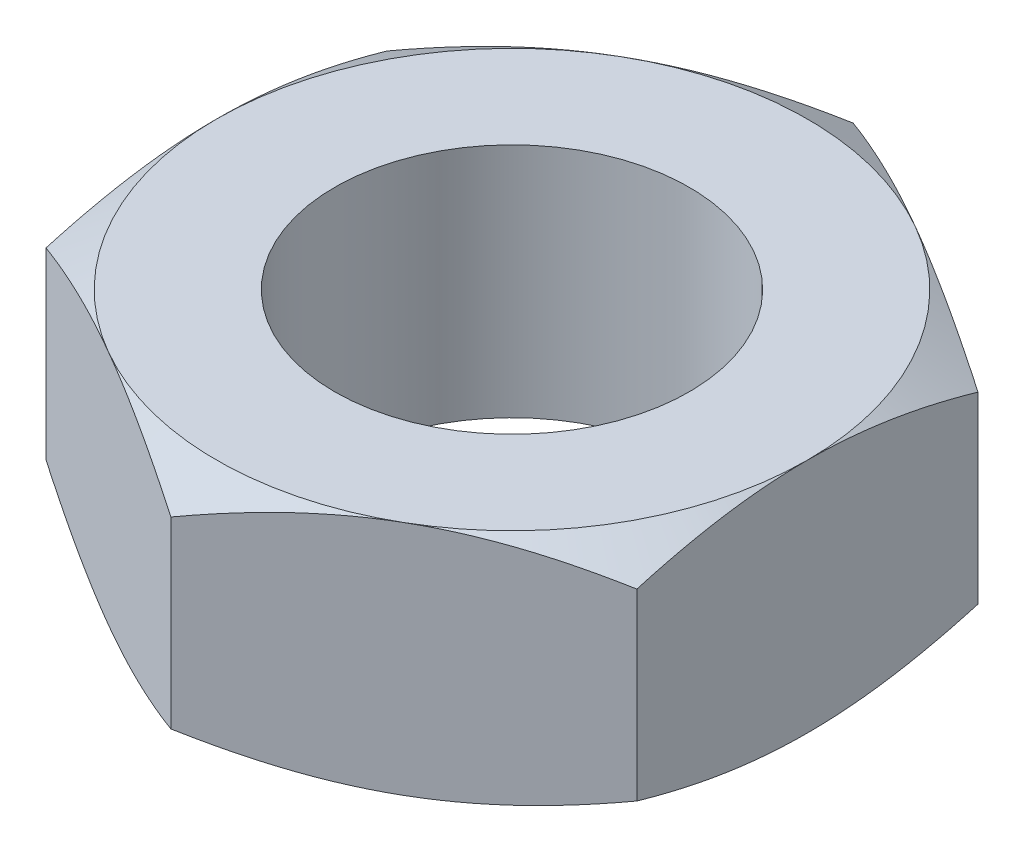
ISO-10303-21;
HEADER;
FILE_DESCRIPTION(('STEP AP214'),'2;1');
FILE_NAME('part.step','',(''),(''),'','','');
FILE_SCHEMA(('AUTOMOTIVE_DESIGN { 1 0 10303 214 1 1 1 1 }'));
ENDSEC;
DATA;
#1=APPLICATION_CONTEXT('core data for automotive mechanical design processes');
#2=APPLICATION_PROTOCOL_DEFINITION('international standard','automotive_design',2000,#1);
#3=PRODUCT_CONTEXT('',#1,'mechanical');
#4=PRODUCT('Part','Part','',(#3));
#5=PRODUCT_RELATED_PRODUCT_CATEGORY('part','',(#4));
#6=PRODUCT_DEFINITION_FORMATION('','',#4);
#7=PRODUCT_DEFINITION_CONTEXT('part definition',#1,'design');
#8=PRODUCT_DEFINITION('design','',#6,#7);
#9=PRODUCT_DEFINITION_SHAPE('','',#8);
#10=(LENGTH_UNIT() NAMED_UNIT(*) SI_UNIT(.MILLI.,.METRE.));
#11=(NAMED_UNIT(*) PLANE_ANGLE_UNIT() SI_UNIT($,.RADIAN.));
#12=(NAMED_UNIT(*) SI_UNIT($,.STERADIAN.) SOLID_ANGLE_UNIT());
#13=UNCERTAINTY_MEASURE_WITH_UNIT(LENGTH_MEASURE(1.E-05),#10,'distance_accuracy_value','');
#14=(GEOMETRIC_REPRESENTATION_CONTEXT(3) GLOBAL_UNCERTAINTY_ASSIGNED_CONTEXT((#13)) GLOBAL_UNIT_ASSIGNED_CONTEXT((#10,
#11,#12)) REPRESENTATION_CONTEXT('',''));
#15=CARTESIAN_POINT('',(0.,0.,0.));
#16=DIRECTION('',(0.,0.,1.));
#17=DIRECTION('',(1.,0.,0.));
#18=AXIS2_PLACEMENT_3D('',#15,#16,#17);
#19=CARTESIAN_POINT('',(0.,0.,0.));
#20=DIRECTION('',(0.,1.,0.));
#21=DIRECTION('',(0.,0.,1.));
#22=AXIS2_PLACEMENT_3D('',#19,#20,#21);
#23=PLANE('',#22);
#24=CARTESIAN_POINT('',(0.,0.,0.));
#25=DIRECTION('',(0.,1.,0.));
#26=DIRECTION('',(0.,0.,1.));
#27=AXIS2_PLACEMENT_3D('',#24,#25,#26);
#28=CIRCLE('',#27,1.5);
#29=CARTESIAN_POINT('',(0.,0.,1.5));
#30=VERTEX_POINT('',#29);
#31=EDGE_CURVE('E277',#30,#30,#28,.T.);
#32=ORIENTED_EDGE('',*,*,#31,.T.);
#33=EDGE_LOOP('',(#32));
#34=FACE_BOUND('',#33,.T.);
#35=CARTESIAN_POINT('',(0.,0.,0.));
#36=DIRECTION('',(0.,1.,0.));
#37=DIRECTION('',(0.,0.,1.));
#38=AXIS2_PLACEMENT_3D('',#35,#36,#37);
#39=CIRCLE('',#38,2.5);
#40=CARTESIAN_POINT('',(1.25,0.,2.1650635094611));
#41=VERTEX_POINT('',#40);
#42=CARTESIAN_POINT('',(-1.25,0.,2.1650635094611));
#43=VERTEX_POINT('',#42);
#44=EDGE_CURVE('E52',#41,#43,#39,.F.);
#45=ORIENTED_EDGE('',*,*,#44,.T.);
#46=CARTESIAN_POINT('',(-2.5,0.,0.));
#47=VERTEX_POINT('',#46);
#48=EDGE_CURVE('E12',#43,#47,#39,.F.);
#49=ORIENTED_EDGE('',*,*,#48,.T.);
#50=CARTESIAN_POINT('',(-1.25,0.,-2.1650635094611));
#51=VERTEX_POINT('',#50);
#52=EDGE_CURVE('E58',#47,#51,#39,.F.);
#53=ORIENTED_EDGE('',*,*,#52,.T.);
#54=CARTESIAN_POINT('',(1.25,0.,-2.1650635094611));
#55=VERTEX_POINT('',#54);
#56=EDGE_CURVE('E398',#51,#55,#39,.F.);
#57=ORIENTED_EDGE('',*,*,#56,.T.);
#58=CARTESIAN_POINT('',(2.5,0.,0.));
#59=VERTEX_POINT('',#58);
#60=EDGE_CURVE('E161',#55,#59,#39,.F.);
#61=ORIENTED_EDGE('',*,*,#60,.T.);
#62=CARTESIAN_POINT('',(0.,0.,0.));
#63=DIRECTION('',(0.,1.,0.));
#64=DIRECTION('',(0.,0.,1.));
#65=AXIS2_PLACEMENT_3D('',#62,#63,#64);
#66=CIRCLE('',#65,2.5);
#67=EDGE_CURVE('E142',#41,#59,#66,.T.);
#68=ORIENTED_EDGE('',*,*,#67,.F.);
#69=EDGE_LOOP('',(#45,#49,#53,#57,#61,#68));
#70=FACE_BOUND('',#69,.T.);
#71=ADVANCED_FACE('F47',(#34,#70),#23,.F.);
#72=CARTESIAN_POINT('',(0.,2.,0.));
#73=DIRECTION('',(0.,1.,0.));
#74=DIRECTION('',(0.,0.,1.));
#75=AXIS2_PLACEMENT_3D('',#72,#73,#74);
#76=PLANE('',#75);
#77=CARTESIAN_POINT('',(0.,2.,0.));
#78=DIRECTION('',(0.,1.,0.));
#79=DIRECTION('',(0.,0.,1.));
#80=AXIS2_PLACEMENT_3D('',#77,#78,#79);
#81=CIRCLE('',#80,1.5);
#82=CARTESIAN_POINT('',(0.,2.,1.5));
#83=VERTEX_POINT('',#82);
#84=EDGE_CURVE('E272',#83,#83,#81,.T.);
#85=ORIENTED_EDGE('',*,*,#84,.F.);
#86=EDGE_LOOP('',(#85));
#87=FACE_BOUND('',#86,.T.);
#88=CARTESIAN_POINT('',(0.,2.,0.));
#89=DIRECTION('',(0.,1.,0.));
#90=DIRECTION('',(0.,0.,1.));
#91=AXIS2_PLACEMENT_3D('',#88,#89,#90);
#92=CIRCLE('',#91,2.5);
#93=CARTESIAN_POINT('',(-1.25,2.,2.1650635094611));
#94=VERTEX_POINT('',#93);
#95=CARTESIAN_POINT('',(1.25,2.,2.1650635094611));
#96=VERTEX_POINT('',#95);
#97=EDGE_CURVE('E334',#94,#96,#92,.T.);
#98=ORIENTED_EDGE('',*,*,#97,.T.);
#99=CARTESIAN_POINT('',(2.5,2.,0.));
#100=VERTEX_POINT('',#99);
#101=EDGE_CURVE('E337',#96,#100,#92,.T.);
#102=ORIENTED_EDGE('',*,*,#101,.T.);
#103=CARTESIAN_POINT('',(1.25,2.,-2.1650635094611));
#104=VERTEX_POINT('',#103);
#105=EDGE_CURVE('E349',#100,#104,#92,.T.);
#106=ORIENTED_EDGE('',*,*,#105,.T.);
#107=CARTESIAN_POINT('',(-1.25,2.,-2.1650635094611));
#108=VERTEX_POINT('',#107);
#109=EDGE_CURVE('E353',#104,#108,#92,.T.);
#110=ORIENTED_EDGE('',*,*,#109,.T.);
#111=CARTESIAN_POINT('',(-2.5,2.,0.));
#112=VERTEX_POINT('',#111);
#113=EDGE_CURVE('E346',#108,#112,#92,.T.);
#114=ORIENTED_EDGE('',*,*,#113,.T.);
#115=EDGE_CURVE('E339',#112,#94,#92,.T.);
#116=ORIENTED_EDGE('',*,*,#115,.T.);
#117=EDGE_LOOP('',(#98,#102,#106,#110,#114,#116));
#118=FACE_BOUND('',#117,.T.);
#119=ADVANCED_FACE('F315',(#87,#118),#76,.T.);
#120=CARTESIAN_POINT('',(2.5,2.,-1.44337567297407));
#121=DIRECTION('',(-0.5,0.,0.866025403784439));
#122=DIRECTION('',(0.866025403784439,0.,0.5));
#123=AXIS2_PLACEMENT_3D('',#120,#121,#122);
#124=PLANE('',#123);
#125=DIRECTION('',(0.,-1.,0.));
#126=VECTOR('',#125,1.);
#127=CARTESIAN_POINT('',(2.5,2.,-1.44337567297407));
#128=LINE('',#127,#126);
#129=CARTESIAN_POINT('',(2.5,1.77670900630741,-1.44337567297408));
#130=VERTEX_POINT('',#129);
#131=CARTESIAN_POINT('',(2.5,0.2232909936926,-1.44337567297407));
#132=VERTEX_POINT('',#131);
#133=EDGE_CURVE('E276',#130,#132,#128,.T.);
#134=ORIENTED_EDGE('',*,*,#133,.T.);
#135=CARTESIAN_POINT('',(2.5002,0.223357664359107,-1.44326020292023));
#136=CARTESIAN_POINT('',(2.39033676526513,0.186721620107625,-1.50668977106845));
#137=CARTESIAN_POINT('',(2.27952520010347,0.153402218965055,-1.57066685804385));
#138=CARTESIAN_POINT('',(2.05598316653395,0.0952422855578571,-1.69972891130041));
#139=CARTESIAN_POINT('',(1.94324872547161,0.0704223291477376,-1.7648161711947));
#140=CARTESIAN_POINT('',(1.71917700612473,0.0317856514410516,-1.8941840386774));
#141=CARTESIAN_POINT('',(1.60787420823262,0.0177117961856387,-1.95844473900197));
#142=CARTESIAN_POINT('',(1.38474477253166,0.000909152352750007,-2.08726857876804));
#143=CARTESIAN_POINT('',(1.27291894598577,-0.00183354879637381,-2.15183124982667));
#144=CARTESIAN_POINT('',(1.06395802444848,0.00386576000805309,-2.27247489412634));
#145=CARTESIAN_POINT('',(0.966791682442267,0.0109083943818614,-2.32857390783979));
#146=CARTESIAN_POINT('',(0.773092050288996,0.0332314191249422,-2.44040644260542));
#147=CARTESIAN_POINT('',(0.676559430340267,0.0485194384402666,-2.4961395767184));
#148=CARTESIAN_POINT('',(0.482460278259523,0.0867390938444197,-2.60820277442169));
#149=CARTESIAN_POINT('',(0.384918318217859,0.109832776125517,-2.66451865130903));
#150=CARTESIAN_POINT('',(0.191289391923915,0.162246656577913,-2.77631036402774));
#151=CARTESIAN_POINT('',(0.0951999441138237,0.191554535624548,-2.83178763258717));
#152=CARTESIAN_POINT('',(-0.000200000000000355,0.223357664359107,-2.88686681600197));
#153=B_SPLINE_CURVE_WITH_KNOTS('',3,(#135,#136,#137,#138,#139,#140,#141,#142,#143,#144,#145,
#146,#147,#148,#149,#150,#151,#152),.UNSPECIFIED.,.F.,.F.,(4,2,2,2,2,2,2,2,4),(0.,
0.396285827362226,0.79352433015205,1.18093086852114,1.56786160134475,1.90479741793733,
2.24204551660463,2.58677531536756,2.93082800105256),.UNSPECIFIED.);
#154=EDGE_CURVE('E71',#132,#55,#153,.T.);
#155=ORIENTED_EDGE('',*,*,#154,.T.);
#156=CARTESIAN_POINT('',(0.,0.223290993692601,-2.88675134594813));
#157=VERTEX_POINT('',#156);
#158=EDGE_CURVE('E206',#55,#157,#153,.T.);
#159=ORIENTED_EDGE('',*,*,#158,.T.);
#160=DIRECTION('',(0.,-1.,0.));
#161=VECTOR('',#160,1.);
#162=CARTESIAN_POINT('',(0.,2.,-2.88675134594813));
#163=LINE('',#162,#161);
#164=CARTESIAN_POINT('',(0.,1.7767090063074,-2.88675134594813));
#165=VERTEX_POINT('',#164);
#166=EDGE_CURVE('E297',#165,#157,#163,.T.);
#167=ORIENTED_EDGE('',*,*,#166,.F.);
#168=CARTESIAN_POINT('',(2.5002,1.77664233564089,-1.44326020292023));
#169=CARTESIAN_POINT('',(2.39033676526513,1.81327837989238,-1.50668977106845));
#170=CARTESIAN_POINT('',(2.27952520010347,1.84659778103494,-1.57066685804385));
#171=CARTESIAN_POINT('',(2.05598316653395,1.90475771444214,-1.69972891130041));
#172=CARTESIAN_POINT('',(1.94324872547161,1.92957767085226,-1.7648161711947));
#173=CARTESIAN_POINT('',(1.71917700612473,1.96821434855895,-1.8941840386774));
#174=CARTESIAN_POINT('',(1.60787420823262,1.98228820381436,-1.95844473900197));
#175=CARTESIAN_POINT('',(1.38474477253166,1.99909084764725,-2.08726857876804));
#176=CARTESIAN_POINT('',(1.27291894598577,2.00183354879637,-2.15183124982667));
#177=CARTESIAN_POINT('',(1.06395802444848,1.99613423999195,-2.27247489412634));
#178=CARTESIAN_POINT('',(0.966791682442267,1.98909160561814,-2.32857390783979));
#179=CARTESIAN_POINT('',(0.773092050288996,1.96676858087506,-2.44040644260542));
#180=CARTESIAN_POINT('',(0.676559430340267,1.95148056155973,-2.4961395767184));
#181=CARTESIAN_POINT('',(0.482460278259523,1.91326090615558,-2.60820277442169));
#182=CARTESIAN_POINT('',(0.384918318217859,1.89016722387448,-2.66451865130903));
#183=CARTESIAN_POINT('',(0.191289391923915,1.83775334342209,-2.77631036402774));
#184=CARTESIAN_POINT('',(0.0951999441138237,1.80844546437545,-2.83178763258717));
#185=CARTESIAN_POINT('',(-0.000200000000000355,1.77664233564089,-2.88686681600197));
#186=B_SPLINE_CURVE_WITH_KNOTS('',3,(#168,#169,#170,#171,#172,#173,#174,#175,#176,#177,#178,
#179,#180,#181,#182,#183,#184,#185),.UNSPECIFIED.,.F.,.F.,(4,2,2,2,2,2,2,2,4),(0.,
0.396285827362227,0.793524330152051,1.18093086852114,1.56786160134475,1.90479741793733,
2.24204551660463,2.58677531536756,2.93082800105256),.UNSPECIFIED.);
#187=EDGE_CURVE('E264',#104,#165,#186,.T.);
#188=ORIENTED_EDGE('',*,*,#187,.F.);
#189=EDGE_CURVE('E271',#130,#104,#186,.T.);
#190=ORIENTED_EDGE('',*,*,#189,.F.);
#191=EDGE_LOOP('',(#134,#155,#159,#167,#188,#190));
#192=FACE_BOUND('',#191,.T.);
#193=ADVANCED_FACE('F49',(#192),#124,.F.);
#194=CARTESIAN_POINT('',(0.,2.,-2.88675134594813));
#195=DIRECTION('',(0.5,0.,0.866025403784439));
#196=DIRECTION('',(0.866025403784439,0.,-0.5));
#197=AXIS2_PLACEMENT_3D('',#194,#195,#196);
#198=PLANE('',#197);
#199=ORIENTED_EDGE('',*,*,#166,.T.);
#200=CARTESIAN_POINT('',(0.000199999999999646,0.223357664359108,-2.88686681600197));
#201=CARTESIAN_POINT('',(-0.109663234734871,0.186721620107625,-2.82343724785375));
#202=CARTESIAN_POINT('',(-0.220474799896526,0.153402218965056,-2.75946016087834));
#203=CARTESIAN_POINT('',(-0.44401683346605,0.0952422855578572,-2.63039810762178));
#204=CARTESIAN_POINT('',(-0.556751274528388,0.0704223291477378,-2.5653108477275));
#205=CARTESIAN_POINT('',(-0.780822993875269,0.0317856514410515,-2.43594298024479));
#206=CARTESIAN_POINT('',(-0.892125791767377,0.0177117961856385,-2.37168227992023));
#207=CARTESIAN_POINT('',(-1.11525522746833,0.000909152352749769,-2.24285844015415));
#208=CARTESIAN_POINT('',(-1.22708105401423,-0.0018335487963739,-2.17829576909552));
#209=CARTESIAN_POINT('',(-1.43604197555152,0.00386576000805306,-2.05765212479586));
#210=CARTESIAN_POINT('',(-1.53320831755773,0.0109083943818613,-2.0015531110824));
#211=CARTESIAN_POINT('',(-1.726907949711,0.033231419124942,-1.88972057631678));
#212=CARTESIAN_POINT('',(-1.82344056965973,0.0485194384402664,-1.8339874422038));
#213=CARTESIAN_POINT('',(-2.01753972174048,0.0867390938444195,-1.7219242445005));
#214=CARTESIAN_POINT('',(-2.11508168178214,0.109832776125516,-1.66560836761316));
#215=CARTESIAN_POINT('',(-2.30871060807608,0.162246656577912,-1.55381665489446));
#216=CARTESIAN_POINT('',(-2.40480005588618,0.191554535624547,-1.49833938633502));
#217=CARTESIAN_POINT('',(-2.5002,0.223357664359107,-1.44326020292023));
#218=B_SPLINE_CURVE_WITH_KNOTS('',3,(#200,#201,#202,#203,#204,#205,#206,#207,#208,#209,#210,
#211,#212,#213,#214,#215,#216,#217),.UNSPECIFIED.,.F.,.F.,(4,2,2,2,2,2,2,2,4),(0.,
0.396285827362227,0.793524330152051,1.18093086852114,1.56786160134475,1.90479741793733,
2.24204551660463,2.58677531536756,2.93082800105256),.UNSPECIFIED.);
#219=EDGE_CURVE('E404',#157,#51,#218,.T.);
#220=ORIENTED_EDGE('',*,*,#219,.T.);
#221=CARTESIAN_POINT('',(-2.5,0.223290993692601,-1.44337567297406));
#222=VERTEX_POINT('',#221);
#223=EDGE_CURVE('E225',#51,#222,#218,.T.);
#224=ORIENTED_EDGE('',*,*,#223,.T.);
#225=DIRECTION('',(0.,-1.,0.));
#226=VECTOR('',#225,1.);
#227=CARTESIAN_POINT('',(-2.5,2.,-1.44337567297406));
#228=LINE('',#227,#226);
#229=CARTESIAN_POINT('',(-2.5,1.7767090063074,-1.44337567297406));
#230=VERTEX_POINT('',#229);
#231=EDGE_CURVE('E293',#230,#222,#228,.T.);
#232=ORIENTED_EDGE('',*,*,#231,.F.);
#233=CARTESIAN_POINT('',(0.000199999999999668,1.77664233564089,-2.88686681600197));
#234=CARTESIAN_POINT('',(-0.109663234734871,1.81327837989237,-2.82343724785375));
#235=CARTESIAN_POINT('',(-0.220474799896526,1.84659778103494,-2.75946016087834));
#236=CARTESIAN_POINT('',(-0.44401683346605,1.90475771444214,-2.63039810762178));
#237=CARTESIAN_POINT('',(-0.556751274528388,1.92957767085226,-2.5653108477275));
#238=CARTESIAN_POINT('',(-0.780822993875269,1.96821434855895,-2.43594298024479));
#239=CARTESIAN_POINT('',(-0.892125791767377,1.98228820381436,-2.37168227992023));
#240=CARTESIAN_POINT('',(-1.11525522746833,1.99909084764725,-2.24285844015415));
#241=CARTESIAN_POINT('',(-1.22708105401423,2.00183354879637,-2.17829576909552));
#242=CARTESIAN_POINT('',(-1.43604197555152,1.99613423999195,-2.05765212479586));
#243=CARTESIAN_POINT('',(-1.53320831755773,1.98909160561814,-2.0015531110824));
#244=CARTESIAN_POINT('',(-1.726907949711,1.96676858087506,-1.88972057631678));
#245=CARTESIAN_POINT('',(-1.82344056965973,1.95148056155973,-1.8339874422038));
#246=CARTESIAN_POINT('',(-2.01753972174048,1.91326090615558,-1.7219242445005));
#247=CARTESIAN_POINT('',(-2.11508168178214,1.89016722387448,-1.66560836761316));
#248=CARTESIAN_POINT('',(-2.30871060807608,1.83775334342209,-1.55381665489446));
#249=CARTESIAN_POINT('',(-2.40480005588618,1.80844546437545,-1.49833938633502));
#250=CARTESIAN_POINT('',(-2.5002,1.77664233564089,-1.44326020292023));
#251=B_SPLINE_CURVE_WITH_KNOTS('',3,(#233,#234,#235,#236,#237,#238,#239,#240,#241,#242,#243,
#244,#245,#246,#247,#248,#249,#250),.UNSPECIFIED.,.F.,.F.,(4,2,2,2,2,2,2,2,4),(0.,
0.396285827362227,0.793524330152051,1.18093086852114,1.56786160134475,1.90479741793733,
2.24204551660463,2.58677531536756,2.93082800105256),.UNSPECIFIED.);
#252=EDGE_CURVE('E256',#108,#230,#251,.T.);
#253=ORIENTED_EDGE('',*,*,#252,.F.);
#254=EDGE_CURVE('E263',#165,#108,#251,.T.);
#255=ORIENTED_EDGE('',*,*,#254,.F.);
#256=EDGE_LOOP('',(#199,#220,#224,#232,#253,#255));
#257=FACE_BOUND('',#256,.T.);
#258=ADVANCED_FACE('F234',(#257),#198,.F.);
#259=CARTESIAN_POINT('',(-2.5,2.,-1.44337567297406));
#260=DIRECTION('',(1.,0.,0.));
#261=DIRECTION('',(0.,0.,-1.));
#262=AXIS2_PLACEMENT_3D('',#259,#260,#261);
#263=PLANE('',#262);
#264=ORIENTED_EDGE('',*,*,#231,.T.);
#265=CARTESIAN_POINT('',(-2.5,1.75051746805577,-4.93486171933444));
#266=CARTESIAN_POINT('',(-2.5,1.69133726261722,-4.8199403481942));
#267=CARTESIAN_POINT('',(-2.5,1.63247825676005,-4.70485212642124));
#268=CARTESIAN_POINT('',(-2.5,1.51556406119456,-4.47426567976795));
#269=CARTESIAN_POINT('',(-2.5,1.45750888635443,-4.35876744735329));
#270=CARTESIAN_POINT('',(-2.5,1.34227244134488,-4.12710089531367));
#271=CARTESIAN_POINT('',(-2.5,1.28509274407798,-4.01093179192169));
#272=CARTESIAN_POINT('',(-2.5,1.17192590701674,-3.77801122649482));
#273=CARTESIAN_POINT('',(-2.5,1.11593878415348,-3.66125975622101));
#274=CARTESIAN_POINT('',(-2.5,1.00253157682963,-3.42088300849687));
#275=CARTESIAN_POINT('',(-2.5,0.945191561608959,-3.2972198482005));
#276=CARTESIAN_POINT('',(-2.5,0.832598686179215,-3.04894788037271));
#277=CARTESIAN_POINT('',(-2.5,0.777345769924555,-2.92433909834246));
#278=CARTESIAN_POINT('',(-2.5,0.669564709168183,-2.67404231382757));
#279=CARTESIAN_POINT('',(-2.5,0.61703474416575,-2.54835509963059));
#280=CARTESIAN_POINT('',(-2.5,0.515470603951828,-2.29553518807957));
#281=CARTESIAN_POINT('',(-2.5,0.466437240853757,-2.16840216282303));
#282=CARTESIAN_POINT('',(-2.5,0.365519045589159,-1.89196933857388));
#283=CARTESIAN_POINT('',(-2.5,0.314430928565564,-1.74237414052597));
#284=CARTESIAN_POINT('',(-2.5,0.220856049236354,-1.4405551511059));
#285=CARTESIAN_POINT('',(-2.5,0.178364945289852,-1.28833272889575));
#286=CARTESIAN_POINT('',(-2.5,0.105752289587978,-0.983942199808394));
#287=CARTESIAN_POINT('',(-2.5,0.0754089672818105,-0.831829132495781));
#288=CARTESIAN_POINT('',(-2.5,0.0406516796303211,-0.602071425625841));
#289=CARTESIAN_POINT('',(-2.5,0.0308592992319906,-0.525228449493815));
#290=CARTESIAN_POINT('',(-2.5,0.0151636656794679,-0.371150643177171));
#291=CARTESIAN_POINT('',(-2.5,0.00925981943211461,-0.293915874561847));
#292=CARTESIAN_POINT('',(-2.5,0.00149945618362636,-0.138177308015548));
#293=CARTESIAN_POINT('',(-2.5,-0.000300329680073107,-0.0596706558577311));
#294=CARTESIAN_POINT('',(-2.5,0.000382182470508331,0.097323703774758));
#295=CARTESIAN_POINT('',(-2.5,0.00286448024898935,0.175811411250473));
#296=CARTESIAN_POINT('',(-2.5,0.012018075101874,0.332556462396662));
#297=CARTESIAN_POINT('',(-2.5,0.0186902391546215,0.410813755021102));
#298=CARTESIAN_POINT('',(-2.5,0.0359818737124378,0.566895759516458));
#299=CARTESIAN_POINT('',(-2.5,0.046601987886553,0.644720398746938));
#300=CARTESIAN_POINT('',(-2.5,0.0843776540425915,0.880425277323259));
#301=CARTESIAN_POINT('',(-2.5,0.117244290445988,1.0374021276822));
#302=CARTESIAN_POINT('',(-2.5,0.194551132550416,1.34841101742391));
#303=CARTESIAN_POINT('',(-2.5,0.238994974726618,1.50244211517955));
#304=CARTESIAN_POINT('',(-2.5,0.334467726657706,1.80198948227857));
#305=CARTESIAN_POINT('',(-2.5,0.385183371784436,1.94760725909515));
#306=CARTESIAN_POINT('',(-2.5,0.492317846941425,2.23674360042291));
#307=CARTESIAN_POINT('',(-2.5,0.54873807533058,2.38026164031034));
#308=CARTESIAN_POINT('',(-2.5,0.66580910898489,2.66572180096044));
#309=CARTESIAN_POINT('',(-2.5,0.726464237701914,2.80766213451906));
#310=CARTESIAN_POINT('',(-2.5,0.850881769521231,3.0901760741915));
#311=CARTESIAN_POINT('',(-2.5,0.914644342755142,3.23074960496675));
#312=CARTESIAN_POINT('',(-2.5,1.04081855009125,3.50283338488746));
#313=CARTESIAN_POINT('',(-2.5,1.10310046173394,3.63440403331771));
#314=CARTESIAN_POINT('',(-2.5,1.22929552548759,3.89676431270017));
#315=CARTESIAN_POINT('',(-2.5,1.29320873128699,4.02755391777178));
#316=CARTESIAN_POINT('',(-2.5,1.42210820195559,4.28806433847912));
#317=CARTESIAN_POINT('',(-2.5,1.48709022600769,4.41778725733017));
#318=CARTESIAN_POINT('',(-2.5,1.61808743263322,4.67669676330922));
#319=CARTESIAN_POINT('',(-2.5,1.68410252583257,4.8058833956229));
#320=CARTESIAN_POINT('',(-2.5,1.75051746805577,4.93486171933444));
#321=B_SPLINE_CURVE_WITH_KNOTS('',3,(#265,#266,#267,#268,#269,#270,#271,#272,#273,#274,#275,
#276,#277,#278,#279,#280,#281,#282,#283,#284,#285,#286,#287,#288,#289,#290,#291,#292,#293,#294,
#295,#296,#297,#298,#299,#300,#301,#302,#303,#304,#305,#306,#307,#308,#309,#310,#311,#312,#313,
#314,#315,#316,#317,#318,#319,#320),.UNSPECIFIED.,.F.,.F.,(4,2,2,2,2,2,2,2,2,2,2,2,2,2,2,2,2,2,
2,2,2,2,2,2,2,2,2,4),(0.,0.387793831894925,0.775594827128253,1.16402581850153,1.5524623207934,
1.96137758264064,2.37028185592793,2.77890912291195,3.1876309897647,3.66167496284643,
4.13547893462243,4.60018855861607,4.83249783003166,5.06477166059454,5.30023727903514,
5.53570288450944,5.77121722921933,6.00676998875774,6.48725754661896,6.96789621109927,
7.43032586595213,7.89286915182352,8.35589175957823,8.81893974621792,9.25562834373433,
9.69233133192936,10.1275921173417,10.5628154528867),.UNSPECIFIED.);
#322=EDGE_CURVE('E224',#222,#47,#321,.T.);
#323=ORIENTED_EDGE('',*,*,#322,.T.);
#324=CARTESIAN_POINT('',(-2.5,0.223290993692601,1.44337567297407));
#325=VERTEX_POINT('',#324);
#326=EDGE_CURVE('E216',#47,#325,#321,.T.);
#327=ORIENTED_EDGE('',*,*,#326,.T.);
#328=DIRECTION('',(0.,-1.,0.));
#329=VECTOR('',#328,1.);
#330=CARTESIAN_POINT('',(-2.5,2.,1.44337567297407));
#331=LINE('',#330,#329);
#332=CARTESIAN_POINT('',(-2.5,1.7767090063074,1.44337567297407));
#333=VERTEX_POINT('',#332);
#334=EDGE_CURVE('E289',#333,#325,#331,.T.);
#335=ORIENTED_EDGE('',*,*,#334,.F.);
#336=CARTESIAN_POINT('',(-2.5,0.249482531944229,-4.93486171933444));
#337=CARTESIAN_POINT('',(-2.5,0.308662737382782,-4.8199403481942));
#338=CARTESIAN_POINT('',(-2.5,0.367521743239951,-4.70485212642124));
#339=CARTESIAN_POINT('',(-2.5,0.484435938805441,-4.47426567976795));
#340=CARTESIAN_POINT('',(-2.5,0.542491113645564,-4.3587674473533));
#341=CARTESIAN_POINT('',(-2.5,0.657727558655124,-4.12710089531367));
#342=CARTESIAN_POINT('',(-2.5,0.714907255922024,-4.01093179192169));
#343=CARTESIAN_POINT('',(-2.5,0.828074092983265,-3.77801122649482));
#344=CARTESIAN_POINT('',(-2.5,0.884061215846522,-3.66125975622101));
#345=CARTESIAN_POINT('',(-2.5,0.997468423170369,-3.42088300849687));
#346=CARTESIAN_POINT('',(-2.5,1.05480843839104,-3.2972198482005));
#347=CARTESIAN_POINT('',(-2.5,1.16740131382078,-3.04894788037271));
#348=CARTESIAN_POINT('',(-2.5,1.22265423007544,-2.92433909834247));
#349=CARTESIAN_POINT('',(-2.5,1.33043529083182,-2.67404231382757));
#350=CARTESIAN_POINT('',(-2.5,1.38296525583425,-2.54835509963059));
#351=CARTESIAN_POINT('',(-2.5,1.48452939604817,-2.29553518807957));
#352=CARTESIAN_POINT('',(-2.5,1.53356275914624,-2.16840216282304));
#353=CARTESIAN_POINT('',(-2.5,1.63448095441084,-1.89196933857388));
#354=CARTESIAN_POINT('',(-2.5,1.68556907143444,-1.74237414052597));
#355=CARTESIAN_POINT('',(-2.5,1.77914395076365,-1.4405551511059));
#356=CARTESIAN_POINT('',(-2.5,1.82163505471015,-1.28833272889575));
#357=CARTESIAN_POINT('',(-2.5,1.89424771041202,-0.983942199808396));
#358=CARTESIAN_POINT('',(-2.5,1.92459103271819,-0.831829132495783));
#359=CARTESIAN_POINT('',(-2.5,1.95934832036968,-0.602071425625843));
#360=CARTESIAN_POINT('',(-2.5,1.96914070076801,-0.525228449493817));
#361=CARTESIAN_POINT('',(-2.5,1.98483633432053,-0.371150643177173));
#362=CARTESIAN_POINT('',(-2.5,1.99074018056789,-0.293915874561848));
#363=CARTESIAN_POINT('',(-2.5,1.99850054381637,-0.138177308015549));
#364=CARTESIAN_POINT('',(-2.5,2.00030032968007,-0.0596706558577322));
#365=CARTESIAN_POINT('',(-2.5,1.99961781752949,0.0973237037747571));
#366=CARTESIAN_POINT('',(-2.5,1.99713551975101,0.175811411250472));
#367=CARTESIAN_POINT('',(-2.5,1.98798192489813,0.33255646239666));
#368=CARTESIAN_POINT('',(-2.5,1.98130976084538,0.410813755021101));
#369=CARTESIAN_POINT('',(-2.5,1.96401812628756,0.566895759516456));
#370=CARTESIAN_POINT('',(-2.5,1.95339801211345,0.644720398746936));
#371=CARTESIAN_POINT('',(-2.5,1.91562234595741,0.880425277323258));
#372=CARTESIAN_POINT('',(-2.5,1.88275570955401,1.0374021276822));
#373=CARTESIAN_POINT('',(-2.5,1.80544886744958,1.34841101742391));
#374=CARTESIAN_POINT('',(-2.5,1.76100502527338,1.50244211517955));
#375=CARTESIAN_POINT('',(-2.5,1.66553227334229,1.80198948227857));
#376=CARTESIAN_POINT('',(-2.5,1.61481662821556,1.94760725909514));
#377=CARTESIAN_POINT('',(-2.5,1.50768215305858,2.23674360042291));
#378=CARTESIAN_POINT('',(-2.5,1.45126192466942,2.38026164031034));
#379=CARTESIAN_POINT('',(-2.5,1.33419089101511,2.66572180096044));
#380=CARTESIAN_POINT('',(-2.5,1.27353576229809,2.80766213451906));
#381=CARTESIAN_POINT('',(-2.5,1.14911823047877,3.0901760741915));
#382=CARTESIAN_POINT('',(-2.5,1.08535565724486,3.23074960496675));
#383=CARTESIAN_POINT('',(-2.5,0.959181449908748,3.50283338488746));
#384=CARTESIAN_POINT('',(-2.5,0.896899538266064,3.63440403331771));
#385=CARTESIAN_POINT('',(-2.5,0.770704474512405,3.89676431270017));
#386=CARTESIAN_POINT('',(-2.5,0.706791268713011,4.02755391777178));
#387=CARTESIAN_POINT('',(-2.5,0.577891798044411,4.28806433847912));
#388=CARTESIAN_POINT('',(-2.5,0.51290977399231,4.41778725733018));
#389=CARTESIAN_POINT('',(-2.5,0.381912567366777,4.67669676330922));
#390=CARTESIAN_POINT('',(-2.5,0.31589747416743,4.8058833956229));
#391=CARTESIAN_POINT('',(-2.5,0.249482531944229,4.93486171933444));
#392=B_SPLINE_CURVE_WITH_KNOTS('',3,(#336,#337,#338,#339,#340,#341,#342,#343,#344,#345,#346,
#347,#348,#349,#350,#351,#352,#353,#354,#355,#356,#357,#358,#359,#360,#361,#362,#363,#364,#365,
#366,#367,#368,#369,#370,#371,#372,#373,#374,#375,#376,#377,#378,#379,#380,#381,#382,#383,#384,
#385,#386,#387,#388,#389,#390,#391),.UNSPECIFIED.,.F.,.F.,(4,2,2,2,2,2,2,2,2,2,2,2,2,2,2,2,2,2,
2,2,2,2,2,2,2,2,2,4),(0.,0.387793831894924,0.775594827128252,1.16402581850153,1.5524623207934,
1.96137758264064,2.37028185592793,2.77890912291195,3.1876309897647,3.66167496284643,
4.13547893462243,4.60018855861607,4.83249783003165,5.06477166059454,5.30023727903514,
5.53570288450944,5.77121722921933,6.00676998875774,6.48725754661897,6.96789621109927,
7.43032586595214,7.89286915182352,8.35589175957823,8.81893974621792,9.25562834373433,
9.69233133192936,10.1275921173417,10.5628154528867),.UNSPECIFIED.);
#393=EDGE_CURVE('E240',#112,#333,#392,.T.);
#394=ORIENTED_EDGE('',*,*,#393,.F.);
#395=EDGE_CURVE('E248',#230,#112,#392,.T.);
#396=ORIENTED_EDGE('',*,*,#395,.F.);
#397=EDGE_LOOP('',(#264,#323,#327,#335,#394,#396));
#398=FACE_BOUND('',#397,.T.);
#399=ADVANCED_FACE('F230',(#398),#263,.F.);
#400=CARTESIAN_POINT('',(-2.5,2.,1.44337567297407));
#401=DIRECTION('',(0.5,0.,-0.866025403784439));
#402=DIRECTION('',(-0.866025403784439,0.,-0.5));
#403=AXIS2_PLACEMENT_3D('',#400,#401,#402);
#404=PLANE('',#403);
#405=ORIENTED_EDGE('',*,*,#334,.T.);
#406=CARTESIAN_POINT('',(-2.5002,0.223357664359107,1.44326020292023));
#407=CARTESIAN_POINT('',(-2.39033676526513,0.186721620107625,1.50668977106845));
#408=CARTESIAN_POINT('',(-2.27952520010347,0.153402218965055,1.57066685804385));
#409=CARTESIAN_POINT('',(-2.05598316653395,0.095242285557857,1.69972891130041));
#410=CARTESIAN_POINT('',(-1.94324872547161,0.0704223291477376,1.7648161711947));
#411=CARTESIAN_POINT('',(-1.71917700612473,0.0317856514410515,1.8941840386774));
#412=CARTESIAN_POINT('',(-1.60787420823262,0.0177117961856385,1.95844473900197));
#413=CARTESIAN_POINT('',(-1.38474477253167,0.000909152352749869,2.08726857876804));
#414=CARTESIAN_POINT('',(-1.27291894598577,-0.00183354879637372,2.15183124982667));
#415=CARTESIAN_POINT('',(-1.06395802444848,0.00386576000805314,2.27247489412634));
#416=CARTESIAN_POINT('',(-0.966791682442268,0.0109083943818612,2.32857390783979));
#417=CARTESIAN_POINT('',(-0.773092050288997,0.033231419124942,2.44040644260542));
#418=CARTESIAN_POINT('',(-0.676559430340267,0.0485194384402667,2.4961395767184));
#419=CARTESIAN_POINT('',(-0.482460278259524,0.0867390938444198,2.60820277442169));
#420=CARTESIAN_POINT('',(-0.384918318217859,0.109832776125516,2.66451865130903));
#421=CARTESIAN_POINT('',(-0.191289391923915,0.162246656577912,2.77631036402774));
#422=CARTESIAN_POINT('',(-0.0951999441138238,0.191554535624547,2.83178763258717));
#423=CARTESIAN_POINT('',(0.000200000000000172,0.223357664359107,2.88686681600197));
#424=B_SPLINE_CURVE_WITH_KNOTS('',3,(#406,#407,#408,#409,#410,#411,#412,#413,#414,#415,#416,
#417,#418,#419,#420,#421,#422,#423),.UNSPECIFIED.,.F.,.F.,(4,2,2,2,2,2,2,2,4),(0.,
0.396285827362226,0.79352433015205,1.18093086852114,1.56786160134475,1.90479741793733,
2.24204551660463,2.58677531536756,2.93082800105256),.UNSPECIFIED.);
#425=EDGE_CURVE('E174',#325,#43,#424,.T.);
#426=ORIENTED_EDGE('',*,*,#425,.T.);
#427=CARTESIAN_POINT('',(0.,0.223290993692601,2.88675134594813));
#428=VERTEX_POINT('',#427);
#429=EDGE_CURVE('E157',#43,#428,#424,.T.);
#430=ORIENTED_EDGE('',*,*,#429,.T.);
#431=DIRECTION('',(0.,-1.,0.));
#432=VECTOR('',#431,1.);
#433=CARTESIAN_POINT('',(0.,2.,2.88675134594813));
#434=LINE('',#433,#432);
#435=CARTESIAN_POINT('',(0.,1.7767090063074,2.88675134594813));
#436=VERTEX_POINT('',#435);
#437=EDGE_CURVE('E171',#436,#428,#434,.T.);
#438=ORIENTED_EDGE('',*,*,#437,.F.);
#439=CARTESIAN_POINT('',(-2.5002,1.77664233564089,1.44326020292023));
#440=CARTESIAN_POINT('',(-2.39033676526513,1.81327837989238,1.50668977106845));
#441=CARTESIAN_POINT('',(-2.27952520010347,1.84659778103494,1.57066685804385));
#442=CARTESIAN_POINT('',(-2.05598316653395,1.90475771444214,1.69972891130041));
#443=CARTESIAN_POINT('',(-1.94324872547161,1.92957767085226,1.7648161711947));
#444=CARTESIAN_POINT('',(-1.71917700612473,1.96821434855895,1.8941840386774));
#445=CARTESIAN_POINT('',(-1.60787420823262,1.98228820381436,1.95844473900197));
#446=CARTESIAN_POINT('',(-1.38474477253167,1.99909084764725,2.08726857876804));
#447=CARTESIAN_POINT('',(-1.27291894598577,2.00183354879637,2.15183124982667));
#448=CARTESIAN_POINT('',(-1.06395802444848,1.99613423999195,2.27247489412634));
#449=CARTESIAN_POINT('',(-0.966791682442269,1.98909160561814,2.32857390783979));
#450=CARTESIAN_POINT('',(-0.773092050288997,1.96676858087506,2.44040644260542));
#451=CARTESIAN_POINT('',(-0.676559430340268,1.95148056155973,2.4961395767184));
#452=CARTESIAN_POINT('',(-0.482460278259524,1.91326090615558,2.60820277442169));
#453=CARTESIAN_POINT('',(-0.384918318217859,1.89016722387448,2.66451865130903));
#454=CARTESIAN_POINT('',(-0.191289391923915,1.83775334342209,2.77631036402774));
#455=CARTESIAN_POINT('',(-0.0951999441138238,1.80844546437545,2.83178763258717));
#456=CARTESIAN_POINT('',(0.000200000000000167,1.77664233564089,2.88686681600197));
#457=B_SPLINE_CURVE_WITH_KNOTS('',3,(#439,#440,#441,#442,#443,#444,#445,#446,#447,#448,#449,
#450,#451,#452,#453,#454,#455,#456),.UNSPECIFIED.,.F.,.F.,(4,2,2,2,2,2,2,2,4),(0.,
0.396285827362226,0.79352433015205,1.18093086852114,1.56786160134475,1.90479741793733,
2.24204551660463,2.58677531536756,2.93082800105256),.UNSPECIFIED.);
#458=EDGE_CURVE('E250',#94,#436,#457,.T.);
#459=ORIENTED_EDGE('',*,*,#458,.F.);
#460=EDGE_CURVE('E249',#333,#94,#457,.T.);
#461=ORIENTED_EDGE('',*,*,#460,.F.);
#462=EDGE_LOOP('',(#405,#426,#430,#438,#459,#461));
#463=FACE_BOUND('',#462,.T.);
#464=ADVANCED_FACE('F233',(#463),#404,.F.);
#465=CARTESIAN_POINT('',(0.,2.,2.88675134594813));
#466=DIRECTION('',(-0.5,0.,-0.866025403784439));
#467=DIRECTION('',(-0.866025403784439,0.,0.5));
#468=AXIS2_PLACEMENT_3D('',#465,#466,#467);
#469=PLANE('',#468);
#470=ORIENTED_EDGE('',*,*,#437,.T.);
#471=CARTESIAN_POINT('',(-0.000199999999999737,0.223357664359108,2.88686681600197));
#472=CARTESIAN_POINT('',(0.109663234734871,0.186721620107625,2.82343724785375));
#473=CARTESIAN_POINT('',(0.220474799896526,0.153402218965056,2.75946016087834));
#474=CARTESIAN_POINT('',(0.44401683346605,0.0952422855578573,2.63039810762178));
#475=CARTESIAN_POINT('',(0.556751274528388,0.0704223291477379,2.5653108477275));
#476=CARTESIAN_POINT('',(0.780822993875269,0.0317856514410517,2.43594298024479));
#477=CARTESIAN_POINT('',(0.892125791767377,0.0177117961856387,2.37168227992023));
#478=CARTESIAN_POINT('',(1.11525522746833,0.000909152352750024,2.24285844015415));
#479=CARTESIAN_POINT('',(1.22708105401423,-0.00183354879637366,2.17829576909553));
#480=CARTESIAN_POINT('',(1.43604197555152,0.00386576000805332,2.05765212479586));
#481=CARTESIAN_POINT('',(1.53320831755773,0.0109083943818616,2.0015531110824));
#482=CARTESIAN_POINT('',(1.726907949711,0.0332314191249424,1.88972057631678));
#483=CARTESIAN_POINT('',(1.82344056965973,0.0485194384402669,1.8339874422038));
#484=CARTESIAN_POINT('',(2.01753972174048,0.0867390938444201,1.7219242445005));
#485=CARTESIAN_POINT('',(2.11508168178214,0.109832776125517,1.66560836761316));
#486=CARTESIAN_POINT('',(2.30871060807609,0.162246656577913,1.55381665489446));
#487=CARTESIAN_POINT('',(2.40480005588618,0.191554535624548,1.49833938633502));
#488=CARTESIAN_POINT('',(2.5002,0.223357664359108,1.44326020292023));
#489=B_SPLINE_CURVE_WITH_KNOTS('',3,(#471,#472,#473,#474,#475,#476,#477,#478,#479,#480,#481,
#482,#483,#484,#485,#486,#487,#488),.UNSPECIFIED.,.F.,.F.,(4,2,2,2,2,2,2,2,4),(0.,
0.396285827362227,0.793524330152051,1.18093086852114,1.56786160134475,1.90479741793733,
2.24204551660463,2.58677531536756,2.93082800105256),.UNSPECIFIED.);
#490=EDGE_CURVE('E151',#428,#41,#489,.T.);
#491=ORIENTED_EDGE('',*,*,#490,.T.);
#492=CARTESIAN_POINT('',(2.5,0.223290993692601,1.44337567297406));
#493=VERTEX_POINT('',#492);
#494=EDGE_CURVE('E138',#41,#493,#489,.T.);
#495=ORIENTED_EDGE('',*,*,#494,.T.);
#496=DIRECTION('',(0.,-1.,0.));
#497=VECTOR('',#496,1.);
#498=CARTESIAN_POINT('',(2.5,2.,1.44337567297406));
#499=LINE('',#498,#497);
#500=CARTESIAN_POINT('',(2.5,1.7767090063074,1.44337567297406));
#501=VERTEX_POINT('',#500);
#502=EDGE_CURVE('E284',#501,#493,#499,.T.);
#503=ORIENTED_EDGE('',*,*,#502,.F.);
#504=CARTESIAN_POINT('',(-0.000199999999999752,1.77664233564089,2.88686681600197));
#505=CARTESIAN_POINT('',(0.109663234734871,1.81327837989237,2.82343724785375));
#506=CARTESIAN_POINT('',(0.220474799896526,1.84659778103494,2.75946016087834));
#507=CARTESIAN_POINT('',(0.44401683346605,1.90475771444214,2.63039810762178));
#508=CARTESIAN_POINT('',(0.556751274528388,1.92957767085226,2.5653108477275));
#509=CARTESIAN_POINT('',(0.780822993875269,1.96821434855895,2.43594298024479));
#510=CARTESIAN_POINT('',(0.892125791767377,1.98228820381436,2.37168227992023));
#511=CARTESIAN_POINT('',(1.11525522746833,1.99909084764725,2.24285844015415));
#512=CARTESIAN_POINT('',(1.22708105401423,2.00183354879637,2.17829576909552));
#513=CARTESIAN_POINT('',(1.43604197555152,1.99613423999195,2.05765212479586));
#514=CARTESIAN_POINT('',(1.53320831755773,1.98909160561814,2.0015531110824));
#515=CARTESIAN_POINT('',(1.726907949711,1.96676858087506,1.88972057631678));
#516=CARTESIAN_POINT('',(1.82344056965973,1.95148056155973,1.8339874422038));
#517=CARTESIAN_POINT('',(2.01753972174048,1.91326090615558,1.7219242445005));
#518=CARTESIAN_POINT('',(2.11508168178214,1.89016722387448,1.66560836761316));
#519=CARTESIAN_POINT('',(2.30871060807609,1.83775334342209,1.55381665489446));
#520=CARTESIAN_POINT('',(2.40480005588618,1.80844546437545,1.49833938633502));
#521=CARTESIAN_POINT('',(2.5002,1.77664233564089,1.44326020292023));
#522=B_SPLINE_CURVE_WITH_KNOTS('',3,(#504,#505,#506,#507,#508,#509,#510,#511,#512,#513,#514,
#515,#516,#517,#518,#519,#520,#521),.UNSPECIFIED.,.F.,.F.,(4,2,2,2,2,2,2,2,4),(0.,
0.396285827362227,0.793524330152051,1.18093086852114,1.56786160134475,1.90479741793733,
2.24204551660463,2.58677531536756,2.93082800105256),.UNSPECIFIED.);
#523=EDGE_CURVE('E348',#96,#501,#522,.T.);
#524=ORIENTED_EDGE('',*,*,#523,.F.);
#525=EDGE_CURVE('E352',#436,#96,#522,.T.);
#526=ORIENTED_EDGE('',*,*,#525,.F.);
#527=EDGE_LOOP('',(#470,#491,#495,#503,#524,#526));
#528=FACE_BOUND('',#527,.T.);
#529=ADVANCED_FACE('F168',(#528),#469,.F.);
#530=CARTESIAN_POINT('',(2.5,2.,1.44337567297406));
#531=DIRECTION('',(-1.,0.,0.));
#532=DIRECTION('',(0.,0.,1.));
#533=AXIS2_PLACEMENT_3D('',#530,#531,#532);
#534=PLANE('',#533);
#535=ORIENTED_EDGE('',*,*,#502,.T.);
#536=CARTESIAN_POINT('',(2.5,1.75051746805577,4.93486171933444));
#537=CARTESIAN_POINT('',(2.5,1.69133726261722,4.8199403481942));
#538=CARTESIAN_POINT('',(2.5,1.63247825676005,4.70485212642124));
#539=CARTESIAN_POINT('',(2.5,1.51556406119456,4.47426567976795));
#540=CARTESIAN_POINT('',(2.5,1.45750888635444,4.3587674473533));
#541=CARTESIAN_POINT('',(2.5,1.34227244134488,4.12710089531367));
#542=CARTESIAN_POINT('',(2.5,1.28509274407798,4.01093179192169));
#543=CARTESIAN_POINT('',(2.5,1.17192590701674,3.77801122649482));
#544=CARTESIAN_POINT('',(2.5,1.11593878415348,3.66125975622101));
#545=CARTESIAN_POINT('',(2.5,1.00253157682963,3.42088300849687));
#546=CARTESIAN_POINT('',(2.5,0.94519156160896,3.2972198482005));
#547=CARTESIAN_POINT('',(2.5,0.832598686179216,3.04894788037271));
#548=CARTESIAN_POINT('',(2.5,0.777345769924556,2.92433909834246));
#549=CARTESIAN_POINT('',(2.5,0.669564709168184,2.67404231382757));
#550=CARTESIAN_POINT('',(2.5,0.617034744165751,2.54835509963059));
#551=CARTESIAN_POINT('',(2.5,0.515470603951829,2.29553518807957));
#552=CARTESIAN_POINT('',(2.5,0.466437240853758,2.16840216282304));
#553=CARTESIAN_POINT('',(2.5,0.36551904558916,1.89196933857388));
#554=CARTESIAN_POINT('',(2.5,0.314430928565565,1.74237414052597));
#555=CARTESIAN_POINT('',(2.5,0.220856049236354,1.4405551511059));
#556=CARTESIAN_POINT('',(2.5,0.178364945289853,1.28833272889575));
#557=CARTESIAN_POINT('',(2.5,0.105752289587979,0.983942199808395));
#558=CARTESIAN_POINT('',(2.5,0.0754089672818111,0.831829132495782));
#559=CARTESIAN_POINT('',(2.5,0.0406516796303214,0.602071425625842));
#560=CARTESIAN_POINT('',(2.5,0.0308592992319907,0.525228449493816));
#561=CARTESIAN_POINT('',(2.5,0.0151636656794679,0.371150643177172));
#562=CARTESIAN_POINT('',(2.5,0.00925981943211464,0.293915874561847));
#563=CARTESIAN_POINT('',(2.5,0.00149945618362641,0.138177308015548));
#564=CARTESIAN_POINT('',(2.5,-0.000300329680073092,0.0596706558577306));
#565=CARTESIAN_POINT('',(2.5,0.000382182470508308,-0.0973237037747589));
#566=CARTESIAN_POINT('',(2.5,0.00286448024898931,-0.175811411250474));
#567=CARTESIAN_POINT('',(2.5,0.0120180751018739,-0.332556462396662));
#568=CARTESIAN_POINT('',(2.5,0.0186902391546215,-0.410813755021103));
#569=CARTESIAN_POINT('',(2.5,0.0359818737124377,-0.566895759516458));
#570=CARTESIAN_POINT('',(2.5,0.0466019878865529,-0.644720398746938));
#571=CARTESIAN_POINT('',(2.5,0.0843776540425914,-0.880425277323259));
#572=CARTESIAN_POINT('',(2.5,0.117244290445988,-1.0374021276822));
#573=CARTESIAN_POINT('',(2.5,0.194551132550416,-1.34841101742391));
#574=CARTESIAN_POINT('',(2.5,0.238994974726619,-1.50244211517955));
#575=CARTESIAN_POINT('',(2.5,0.334467726657706,-1.80198948227857));
#576=CARTESIAN_POINT('',(2.5,0.385183371784436,-1.94760725909515));
#577=CARTESIAN_POINT('',(2.5,0.492317846941425,-2.23674360042291));
#578=CARTESIAN_POINT('',(2.5,0.54873807533058,-2.38026164031034));
#579=CARTESIAN_POINT('',(2.5,0.665809108984891,-2.66572180096044));
#580=CARTESIAN_POINT('',(2.5,0.726464237701914,-2.80766213451906));
#581=CARTESIAN_POINT('',(2.5,0.850881769521231,-3.0901760741915));
#582=CARTESIAN_POINT('',(2.5,0.914644342755143,-3.23074960496675));
#583=CARTESIAN_POINT('',(2.5,1.04081855009125,-3.50283338488747));
#584=CARTESIAN_POINT('',(2.5,1.10310046173394,-3.63440403331771));
#585=CARTESIAN_POINT('',(2.5,1.2292955254876,-3.89676431270018));
#586=CARTESIAN_POINT('',(2.5,1.29320873128699,-4.02755391777179));
#587=CARTESIAN_POINT('',(2.5,1.42210820195559,-4.28806433847913));
#588=CARTESIAN_POINT('',(2.5,1.48709022600769,-4.41778725733018));
#589=CARTESIAN_POINT('',(2.5,1.61808743263322,-4.67669676330922));
#590=CARTESIAN_POINT('',(2.5,1.68410252583257,-4.8058833956229));
#591=CARTESIAN_POINT('',(2.5,1.75051746805577,-4.93486171933444));
#592=B_SPLINE_CURVE_WITH_KNOTS('',3,(#536,#537,#538,#539,#540,#541,#542,#543,#544,#545,#546,
#547,#548,#549,#550,#551,#552,#553,#554,#555,#556,#557,#558,#559,#560,#561,#562,#563,#564,#565,
#566,#567,#568,#569,#570,#571,#572,#573,#574,#575,#576,#577,#578,#579,#580,#581,#582,#583,#584,
#585,#586,#587,#588,#589,#590,#591),.UNSPECIFIED.,.F.,.F.,(4,2,2,2,2,2,2,2,2,2,2,2,2,2,2,2,2,2,
2,2,2,2,2,2,2,2,2,4),(0.,0.387793831894925,0.775594827128253,1.16402581850153,1.5524623207934,
1.96137758264064,2.37028185592793,2.77890912291195,3.1876309897647,3.66167496284643,
4.13547893462243,4.60018855861608,4.83249783003166,5.06477166059454,5.30023727903514,
5.53570288450945,5.77121722921933,6.00676998875775,6.48725754661897,6.96789621109928,
7.43032586595214,7.89286915182353,8.35589175957823,8.81893974621792,9.25562834373433,
9.69233133192937,10.1275921173417,10.5628154528867),.UNSPECIFIED.);
#593=EDGE_CURVE('E145',#493,#59,#592,.T.);
#594=ORIENTED_EDGE('',*,*,#593,.T.);
#595=EDGE_CURVE('E165',#59,#132,#592,.T.);
#596=ORIENTED_EDGE('',*,*,#595,.T.);
#597=ORIENTED_EDGE('',*,*,#133,.F.);
#598=CARTESIAN_POINT('',(2.5,0.249482531944228,4.93486171933444));
#599=CARTESIAN_POINT('',(2.5,0.308662737382781,4.8199403481942));
#600=CARTESIAN_POINT('',(2.5,0.36752174323995,4.70485212642124));
#601=CARTESIAN_POINT('',(2.5,0.48443593880544,4.47426567976795));
#602=CARTESIAN_POINT('',(2.5,0.542491113645563,4.3587674473533));
#603=CARTESIAN_POINT('',(2.5,0.657727558655123,4.12710089531368));
#604=CARTESIAN_POINT('',(2.5,0.714907255922022,4.01093179192169));
#605=CARTESIAN_POINT('',(2.5,0.828074092983264,3.77801122649482));
#606=CARTESIAN_POINT('',(2.5,0.884061215846521,3.66125975622101));
#607=CARTESIAN_POINT('',(2.5,0.997468423170368,3.42088300849687));
#608=CARTESIAN_POINT('',(2.5,1.05480843839104,3.2972198482005));
#609=CARTESIAN_POINT('',(2.5,1.16740131382078,3.04894788037271));
#610=CARTESIAN_POINT('',(2.5,1.22265423007544,2.92433909834246));
#611=CARTESIAN_POINT('',(2.5,1.33043529083182,2.67404231382757));
#612=CARTESIAN_POINT('',(2.5,1.38296525583425,2.54835509963059));
#613=CARTESIAN_POINT('',(2.5,1.48452939604817,2.29553518807957));
#614=CARTESIAN_POINT('',(2.5,1.53356275914624,2.16840216282303));
#615=CARTESIAN_POINT('',(2.5,1.63448095441084,1.89196933857388));
#616=CARTESIAN_POINT('',(2.5,1.68556907143444,1.74237414052597));
#617=CARTESIAN_POINT('',(2.5,1.77914395076365,1.4405551511059));
#618=CARTESIAN_POINT('',(2.5,1.82163505471015,1.28833272889575));
#619=CARTESIAN_POINT('',(2.5,1.89424771041202,0.983942199808395));
#620=CARTESIAN_POINT('',(2.5,1.92459103271819,0.831829132495781));
#621=CARTESIAN_POINT('',(2.5,1.95934832036968,0.602071425625842));
#622=CARTESIAN_POINT('',(2.5,1.96914070076801,0.525228449493816));
#623=CARTESIAN_POINT('',(2.5,1.98483633432053,0.371150643177172));
#624=CARTESIAN_POINT('',(2.5,1.99074018056789,0.293915874561847));
#625=CARTESIAN_POINT('',(2.5,1.99850054381637,0.138177308015549));
#626=CARTESIAN_POINT('',(2.5,2.00030032968007,0.0596706558577314));
#627=CARTESIAN_POINT('',(2.5,1.99961781752949,-0.0973237037747579));
#628=CARTESIAN_POINT('',(2.5,1.99713551975101,-0.175811411250473));
#629=CARTESIAN_POINT('',(2.5,1.98798192489813,-0.332556462396662));
#630=CARTESIAN_POINT('',(2.5,1.98130976084538,-0.410813755021102));
#631=CARTESIAN_POINT('',(2.5,1.96401812628756,-0.566895759516457));
#632=CARTESIAN_POINT('',(2.5,1.95339801211345,-0.644720398746938));
#633=CARTESIAN_POINT('',(2.5,1.91562234595741,-0.880425277323259));
#634=CARTESIAN_POINT('',(2.5,1.88275570955401,-1.0374021276822));
#635=CARTESIAN_POINT('',(2.5,1.80544886744958,-1.34841101742391));
#636=CARTESIAN_POINT('',(2.5,1.76100502527338,-1.50244211517955));
#637=CARTESIAN_POINT('',(2.5,1.66553227334229,-1.80198948227857));
#638=CARTESIAN_POINT('',(2.5,1.61481662821556,-1.94760725909515));
#639=CARTESIAN_POINT('',(2.5,1.50768215305858,-2.23674360042291));
#640=CARTESIAN_POINT('',(2.5,1.45126192466942,-2.38026164031034));
#641=CARTESIAN_POINT('',(2.5,1.33419089101511,-2.66572180096045));
#642=CARTESIAN_POINT('',(2.5,1.27353576229809,-2.80766213451906));
#643=CARTESIAN_POINT('',(2.5,1.14911823047877,-3.0901760741915));
#644=CARTESIAN_POINT('',(2.5,1.08535565724486,-3.23074960496675));
#645=CARTESIAN_POINT('',(2.5,0.959181449908747,-3.50283338488747));
#646=CARTESIAN_POINT('',(2.5,0.896899538266062,-3.63440403331771));
#647=CARTESIAN_POINT('',(2.5,0.770704474512403,-3.89676431270018));
#648=CARTESIAN_POINT('',(2.5,0.706791268713009,-4.02755391777179));
#649=CARTESIAN_POINT('',(2.5,0.57789179804441,-4.28806433847913));
#650=CARTESIAN_POINT('',(2.5,0.512909773992308,-4.41778725733018));
#651=CARTESIAN_POINT('',(2.5,0.381912567366776,-4.67669676330922));
#652=CARTESIAN_POINT('',(2.5,0.315897474167429,-4.8058833956229));
#653=CARTESIAN_POINT('',(2.5,0.249482531944229,-4.93486171933444));
#654=B_SPLINE_CURVE_WITH_KNOTS('',3,(#598,#599,#600,#601,#602,#603,#604,#605,#606,#607,#608,
#609,#610,#611,#612,#613,#614,#615,#616,#617,#618,#619,#620,#621,#622,#623,#624,#625,#626,#627,
#628,#629,#630,#631,#632,#633,#634,#635,#636,#637,#638,#639,#640,#641,#642,#643,#644,#645,#646,
#647,#648,#649,#650,#651,#652,#653),.UNSPECIFIED.,.F.,.F.,(4,2,2,2,2,2,2,2,2,2,2,2,2,2,2,2,2,2,
2,2,2,2,2,2,2,2,2,4),(0.,0.387793831894924,0.775594827128251,1.16402581850153,1.5524623207934,
1.96137758264064,2.37028185592793,2.77890912291195,3.1876309897647,3.66167496284643,
4.13547893462243,4.60018855861608,4.83249783003166,5.06477166059454,5.30023727903514,
5.53570288450945,5.77121722921934,6.00676998875775,6.48725754661897,6.96789621109928,
7.43032586595214,7.89286915182353,8.35589175957824,8.81893974621793,9.25562834373434,
9.69233133192937,10.1275921173417,10.5628154528867),.UNSPECIFIED.);
#655=EDGE_CURVE('E300',#100,#130,#654,.T.);
#656=ORIENTED_EDGE('',*,*,#655,.F.);
#657=EDGE_CURVE('E162',#501,#100,#654,.T.);
#658=ORIENTED_EDGE('',*,*,#657,.F.);
#659=EDGE_LOOP('',(#535,#594,#596,#597,#656,#658));
#660=FACE_BOUND('',#659,.T.);
#661=ADVANCED_FACE('F306',(#660),#534,.F.);
#662=CARTESIAN_POINT('',(0.,2.,0.));
#663=DIRECTION('',(0.,-1.,0.));
#664=DIRECTION('',(0.,0.,-1.));
#665=AXIS2_PLACEMENT_3D('',#662,#663,#664);
#666=CYLINDRICAL_SURFACE('',#665,1.5);
#667=ORIENTED_EDGE('',*,*,#84,.T.);
#668=EDGE_LOOP('',(#667));
#669=FACE_BOUND('',#668,.T.);
#670=ORIENTED_EDGE('',*,*,#31,.F.);
#671=EDGE_LOOP('',(#670));
#672=FACE_BOUND('',#671,.T.);
#673=ADVANCED_FACE('F310',(#669,#672),#666,.F.);
#674=CARTESIAN_POINT('',(0.,2.,0.));
#675=DIRECTION('',(0.,-1.,0.));
#676=DIRECTION('',(0.,0.,1.));
#677=AXIS2_PLACEMENT_3D('',#674,#675,#676);
#678=CONICAL_SURFACE('',#677,2.5,1.0471975511966);
#679=ORIENTED_EDGE('',*,*,#189,.T.);
#680=ORIENTED_EDGE('',*,*,#105,.F.);
#681=ORIENTED_EDGE('',*,*,#655,.T.);
#682=EDGE_LOOP('',(#679,#680,#681));
#683=FACE_BOUND('',#682,.T.);
#684=ADVANCED_FACE('F200',(#683),#678,.T.);
#685=ORIENTED_EDGE('',*,*,#523,.T.);
#686=ORIENTED_EDGE('',*,*,#657,.T.);
#687=ORIENTED_EDGE('',*,*,#101,.F.);
#688=EDGE_LOOP('',(#685,#686,#687));
#689=FACE_BOUND('',#688,.T.);
#690=ADVANCED_FACE('F324',(#689),#678,.T.);
#691=ORIENTED_EDGE('',*,*,#458,.T.);
#692=ORIENTED_EDGE('',*,*,#525,.T.);
#693=ORIENTED_EDGE('',*,*,#97,.F.);
#694=EDGE_LOOP('',(#691,#692,#693));
#695=FACE_BOUND('',#694,.T.);
#696=ADVANCED_FACE('F385',(#695),#678,.T.);
#697=ORIENTED_EDGE('',*,*,#393,.T.);
#698=ORIENTED_EDGE('',*,*,#460,.T.);
#699=ORIENTED_EDGE('',*,*,#115,.F.);
#700=EDGE_LOOP('',(#697,#698,#699));
#701=FACE_BOUND('',#700,.T.);
#702=ADVANCED_FACE('F427',(#701),#678,.T.);
#703=ORIENTED_EDGE('',*,*,#252,.T.);
#704=ORIENTED_EDGE('',*,*,#395,.T.);
#705=ORIENTED_EDGE('',*,*,#113,.F.);
#706=EDGE_LOOP('',(#703,#704,#705));
#707=FACE_BOUND('',#706,.T.);
#708=ADVANCED_FACE('F361',(#707),#678,.T.);
#709=ORIENTED_EDGE('',*,*,#187,.T.);
#710=ORIENTED_EDGE('',*,*,#254,.T.);
#711=ORIENTED_EDGE('',*,*,#109,.F.);
#712=EDGE_LOOP('',(#709,#710,#711));
#713=FACE_BOUND('',#712,.T.);
#714=ADVANCED_FACE('F326',(#713),#678,.T.);
#715=CARTESIAN_POINT('',(0.,0.,0.));
#716=DIRECTION('',(0.,1.,0.));
#717=DIRECTION('',(0.,0.,1.));
#718=AXIS2_PLACEMENT_3D('',#715,#716,#717);
#719=CONICAL_SURFACE('',#718,2.5,1.0471975511966);
#720=ORIENTED_EDGE('',*,*,#44,.F.);
#721=ORIENTED_EDGE('',*,*,#490,.F.);
#722=ORIENTED_EDGE('',*,*,#429,.F.);
#723=EDGE_LOOP('',(#720,#721,#722));
#724=FACE_BOUND('',#723,.T.);
#725=ADVANCED_FACE('F155',(#724),#719,.T.);
#726=ORIENTED_EDGE('',*,*,#67,.T.);
#727=ORIENTED_EDGE('',*,*,#593,.F.);
#728=ORIENTED_EDGE('',*,*,#494,.F.);
#729=EDGE_LOOP('',(#726,#727,#728));
#730=FACE_BOUND('',#729,.T.);
#731=ADVANCED_FACE('F140',(#730),#719,.T.);
#732=ORIENTED_EDGE('',*,*,#595,.F.);
#733=ORIENTED_EDGE('',*,*,#60,.F.);
#734=ORIENTED_EDGE('',*,*,#154,.F.);
#735=EDGE_LOOP('',(#732,#733,#734));
#736=FACE_BOUND('',#735,.T.);
#737=ADVANCED_FACE('F195',(#736),#719,.T.);
#738=ORIENTED_EDGE('',*,*,#56,.F.);
#739=ORIENTED_EDGE('',*,*,#219,.F.);
#740=ORIENTED_EDGE('',*,*,#158,.F.);
#741=EDGE_LOOP('',(#738,#739,#740));
#742=FACE_BOUND('',#741,.T.);
#743=ADVANCED_FACE('F199',(#742),#719,.T.);
#744=ORIENTED_EDGE('',*,*,#52,.F.);
#745=ORIENTED_EDGE('',*,*,#322,.F.);
#746=ORIENTED_EDGE('',*,*,#223,.F.);
#747=EDGE_LOOP('',(#744,#745,#746));
#748=FACE_BOUND('',#747,.T.);
#749=ADVANCED_FACE('F415',(#748),#719,.T.);
#750=ORIENTED_EDGE('',*,*,#48,.F.);
#751=ORIENTED_EDGE('',*,*,#425,.F.);
#752=ORIENTED_EDGE('',*,*,#326,.F.);
#753=EDGE_LOOP('',(#750,#751,#752));
#754=FACE_BOUND('',#753,.T.);
#755=ADVANCED_FACE('F413',(#754),#719,.T.);
#756=CLOSED_SHELL('',(#71,#119,#193,#258,#399,#464,#529,#661,#673,#684,#690,#696,#702,#708,#714,
#725,#731,#737,#743,#749,#755));
#757=MANIFOLD_SOLID_BREP('B2',#756);
#758=ADVANCED_BREP_SHAPE_REPRESENTATION('',(#18,#757),#14);
#759=SHAPE_DEFINITION_REPRESENTATION(#9,#758);
ENDSEC;
END-ISO-10303-21;
